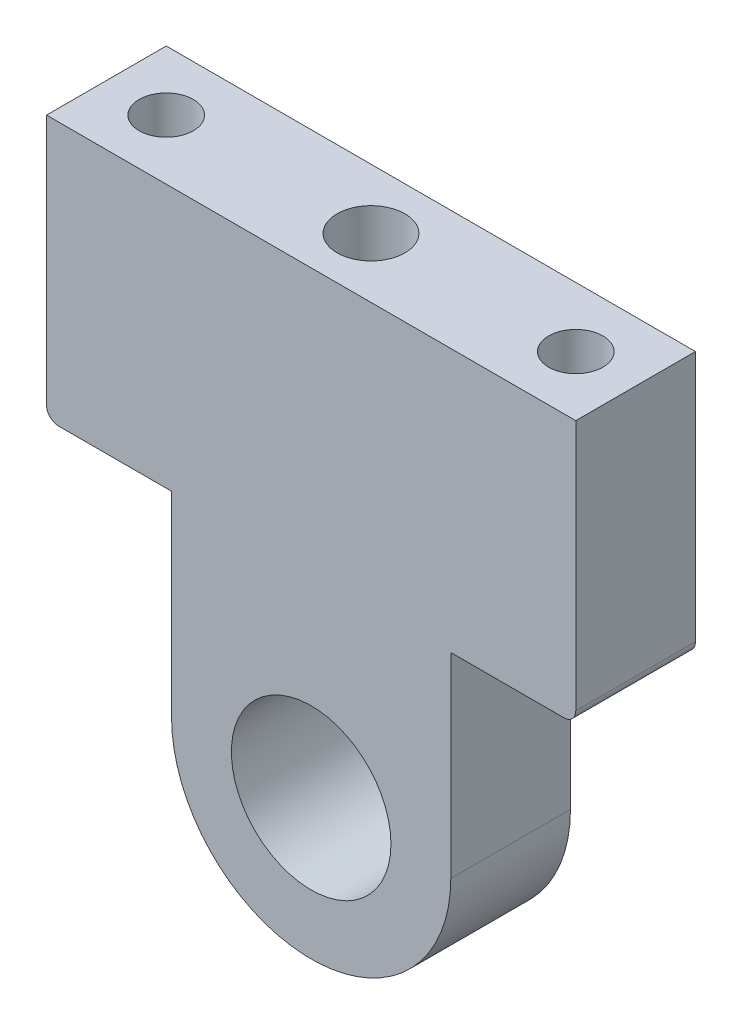
ISO-10303-21;
HEADER;
FILE_DESCRIPTION(('STEP AP214'),'2;1');
FILE_NAME('part.step','',(''),(''),'','','');
FILE_SCHEMA(('AUTOMOTIVE_DESIGN { 1 0 10303 214 1 1 1 1 }'));
ENDSEC;
DATA;
#1=APPLICATION_CONTEXT('core data for automotive mechanical design processes');
#2=APPLICATION_PROTOCOL_DEFINITION('international standard','automotive_design',2000,#1);
#3=PRODUCT_CONTEXT('',#1,'mechanical');
#4=PRODUCT('Part','Part','',(#3));
#5=PRODUCT_RELATED_PRODUCT_CATEGORY('part','',(#4));
#6=PRODUCT_DEFINITION_FORMATION('','',#4);
#7=PRODUCT_DEFINITION_CONTEXT('part definition',#1,'design');
#8=PRODUCT_DEFINITION('design','',#6,#7);
#9=PRODUCT_DEFINITION_SHAPE('','',#8);
#10=(LENGTH_UNIT() NAMED_UNIT(*) SI_UNIT(.MILLI.,.METRE.));
#11=(NAMED_UNIT(*) PLANE_ANGLE_UNIT() SI_UNIT($,.RADIAN.));
#12=(NAMED_UNIT(*) SI_UNIT($,.STERADIAN.) SOLID_ANGLE_UNIT());
#13=UNCERTAINTY_MEASURE_WITH_UNIT(LENGTH_MEASURE(1.E-05),#10,'distance_accuracy_value','');
#14=(GEOMETRIC_REPRESENTATION_CONTEXT(3) GLOBAL_UNCERTAINTY_ASSIGNED_CONTEXT((#13)) GLOBAL_UNIT_ASSIGNED_CONTEXT((#10,
#11,#12)) REPRESENTATION_CONTEXT('',''));
#15=CARTESIAN_POINT('',(0.,0.,0.));
#16=DIRECTION('',(0.,0.,1.));
#17=DIRECTION('',(1.,0.,0.));
#18=AXIS2_PLACEMENT_3D('',#15,#16,#17);
#19=CARTESIAN_POINT('',(33.165,-24.529,15.));
#20=DIRECTION('',(0.,0.,1.));
#21=DIRECTION('',(1.,0.,0.));
#22=AXIS2_PLACEMENT_3D('',#19,#20,#21);
#23=PLANE('',#22);
#24=DIRECTION('',(1.,0.,0.));
#25=VECTOR('',#24,1.);
#26=CARTESIAN_POINT('',(50.665,0.,15.));
#27=LINE('',#26,#25);
#28=CARTESIAN_POINT('',(50.665,0.,15.));
#29=VERTEX_POINT('',#28);
#30=CARTESIAN_POINT('',(64.83,0.,15.));
#31=VERTEX_POINT('',#30);
#32=EDGE_CURVE('E213',#29,#31,#27,.T.);
#33=ORIENTED_EDGE('',*,*,#32,.T.);
#34=CARTESIAN_POINT('',(64.83,1.5,15.));
#35=DIRECTION('',(0.,0.,1.));
#36=DIRECTION('',(1.,0.,0.));
#37=AXIS2_PLACEMENT_3D('',#34,#35,#36);
#38=CIRCLE('',#37,1.5);
#39=CARTESIAN_POINT('',(66.33,1.5,15.));
#40=VERTEX_POINT('',#39);
#41=EDGE_CURVE('E153',#31,#40,#38,.T.);
#42=ORIENTED_EDGE('',*,*,#41,.T.);
#43=DIRECTION('',(0.,1.,0.));
#44=VECTOR('',#43,1.);
#45=CARTESIAN_POINT('',(66.33,0.,15.));
#46=LINE('',#45,#44);
#47=CARTESIAN_POINT('',(66.33,33.,15.));
#48=VERTEX_POINT('',#47);
#49=EDGE_CURVE('E211',#40,#48,#46,.T.);
#50=ORIENTED_EDGE('',*,*,#49,.T.);
#51=DIRECTION('',(-1.,0.,0.));
#52=VECTOR('',#51,1.);
#53=CARTESIAN_POINT('',(0.,33.,15.));
#54=LINE('',#53,#52);
#55=CARTESIAN_POINT('',(0.,33.,15.));
#56=VERTEX_POINT('',#55);
#57=EDGE_CURVE('E217',#48,#56,#54,.T.);
#58=ORIENTED_EDGE('',*,*,#57,.T.);
#59=DIRECTION('',(0.,-1.,0.));
#60=VECTOR('',#59,1.);
#61=CARTESIAN_POINT('',(0.,0.,15.));
#62=LINE('',#61,#60);
#63=CARTESIAN_POINT('',(0.,1.5,15.));
#64=VERTEX_POINT('',#63);
#65=EDGE_CURVE('E170',#56,#64,#62,.T.);
#66=ORIENTED_EDGE('',*,*,#65,.T.);
#67=CARTESIAN_POINT('',(1.5,1.5,15.));
#68=DIRECTION('',(0.,0.,1.));
#69=DIRECTION('',(1.,0.,0.));
#70=AXIS2_PLACEMENT_3D('',#67,#68,#69);
#71=CIRCLE('',#70,1.5);
#72=CARTESIAN_POINT('',(1.5,0.,15.));
#73=VERTEX_POINT('',#72);
#74=EDGE_CURVE('E59',#64,#73,#71,.T.);
#75=ORIENTED_EDGE('',*,*,#74,.T.);
#76=DIRECTION('',(1.,0.,0.));
#77=VECTOR('',#76,1.);
#78=CARTESIAN_POINT('',(0.,0.,15.));
#79=LINE('',#78,#77);
#80=CARTESIAN_POINT('',(15.665,0.,15.));
#81=VERTEX_POINT('',#80);
#82=EDGE_CURVE('E113',#73,#81,#79,.T.);
#83=ORIENTED_EDGE('',*,*,#82,.T.);
#84=DIRECTION('',(0.,-1.,0.));
#85=VECTOR('',#84,1.);
#86=CARTESIAN_POINT('',(15.665,0.,15.));
#87=LINE('',#86,#85);
#88=CARTESIAN_POINT('',(15.665,-24.529,15.));
#89=VERTEX_POINT('',#88);
#90=EDGE_CURVE('E117',#81,#89,#87,.T.);
#91=ORIENTED_EDGE('',*,*,#90,.T.);
#92=CARTESIAN_POINT('',(33.165,-24.529,15.));
#93=DIRECTION('',(0.,0.,1.));
#94=DIRECTION('',(1.,0.,0.));
#95=AXIS2_PLACEMENT_3D('',#92,#93,#94);
#96=CIRCLE('',#95,17.5);
#97=CARTESIAN_POINT('',(50.665,-24.529,15.));
#98=VERTEX_POINT('',#97);
#99=EDGE_CURVE('E132',#89,#98,#96,.T.);
#100=ORIENTED_EDGE('',*,*,#99,.T.);
#101=DIRECTION('',(0.,1.,0.));
#102=VECTOR('',#101,1.);
#103=CARTESIAN_POINT('',(50.665,0.,15.));
#104=LINE('',#103,#102);
#105=EDGE_CURVE('E199',#98,#29,#104,.T.);
#106=ORIENTED_EDGE('',*,*,#105,.T.);
#107=EDGE_LOOP('',(#33,#42,#50,#58,#66,#75,#83,#91,#100,#106));
#108=FACE_BOUND('',#107,.T.);
#109=CARTESIAN_POINT('',(33.165,-24.529,15.));
#110=DIRECTION('',(0.,0.,1.));
#111=DIRECTION('',(1.,0.,0.));
#112=AXIS2_PLACEMENT_3D('',#109,#110,#111);
#113=CIRCLE('',#112,10.);
#114=CARTESIAN_POINT('',(43.165,-24.529,15.));
#115=VERTEX_POINT('',#114);
#116=EDGE_CURVE('E162',#115,#115,#113,.T.);
#117=ORIENTED_EDGE('',*,*,#116,.F.);
#118=EDGE_LOOP('',(#117));
#119=FACE_BOUND('',#118,.T.);
#120=ADVANCED_FACE('F39',(#108,#119),#23,.T.);
#121=CARTESIAN_POINT('',(33.165,-24.529,0.));
#122=DIRECTION('',(0.,0.,1.));
#123=DIRECTION('',(1.,0.,0.));
#124=AXIS2_PLACEMENT_3D('',#121,#122,#123);
#125=PLANE('',#124);
#126=DIRECTION('',(0.,1.,0.));
#127=VECTOR('',#126,1.);
#128=CARTESIAN_POINT('',(66.33,0.,0.));
#129=LINE('',#128,#127);
#130=CARTESIAN_POINT('',(66.33,1.5,0.));
#131=VERTEX_POINT('',#130);
#132=CARTESIAN_POINT('',(66.33,33.,0.));
#133=VERTEX_POINT('',#132);
#134=EDGE_CURVE('E179',#131,#133,#129,.T.);
#135=ORIENTED_EDGE('',*,*,#134,.F.);
#136=CARTESIAN_POINT('',(64.83,1.5,0.));
#137=DIRECTION('',(0.,0.,1.));
#138=DIRECTION('',(1.,0.,0.));
#139=AXIS2_PLACEMENT_3D('',#136,#137,#138);
#140=CIRCLE('',#139,1.5);
#141=CARTESIAN_POINT('',(64.83,0.,0.));
#142=VERTEX_POINT('',#141);
#143=EDGE_CURVE('E148',#131,#142,#140,.F.);
#144=ORIENTED_EDGE('',*,*,#143,.T.);
#145=DIRECTION('',(1.,0.,0.));
#146=VECTOR('',#145,1.);
#147=CARTESIAN_POINT('',(50.665,0.,0.));
#148=LINE('',#147,#146);
#149=CARTESIAN_POINT('',(50.665,0.,0.));
#150=VERTEX_POINT('',#149);
#151=EDGE_CURVE('E176',#150,#142,#148,.T.);
#152=ORIENTED_EDGE('',*,*,#151,.F.);
#153=DIRECTION('',(0.,1.,0.));
#154=VECTOR('',#153,1.);
#155=CARTESIAN_POINT('',(50.665,0.,0.));
#156=LINE('',#155,#154);
#157=CARTESIAN_POINT('',(50.665,-24.529,0.));
#158=VERTEX_POINT('',#157);
#159=EDGE_CURVE('E174',#158,#150,#156,.T.);
#160=ORIENTED_EDGE('',*,*,#159,.F.);
#161=CARTESIAN_POINT('',(33.165,-24.529,0.));
#162=DIRECTION('',(0.,0.,1.));
#163=DIRECTION('',(1.,0.,0.));
#164=AXIS2_PLACEMENT_3D('',#161,#162,#163);
#165=CIRCLE('',#164,17.5);
#166=CARTESIAN_POINT('',(15.665,-24.529,0.));
#167=VERTEX_POINT('',#166);
#168=EDGE_CURVE('E164',#167,#158,#165,.T.);
#169=ORIENTED_EDGE('',*,*,#168,.F.);
#170=DIRECTION('',(0.,-1.,0.));
#171=VECTOR('',#170,1.);
#172=CARTESIAN_POINT('',(15.665,0.,0.));
#173=LINE('',#172,#171);
#174=CARTESIAN_POINT('',(15.665,0.,0.));
#175=VERTEX_POINT('',#174);
#176=EDGE_CURVE('E161',#175,#167,#173,.T.);
#177=ORIENTED_EDGE('',*,*,#176,.F.);
#178=DIRECTION('',(1.,0.,0.));
#179=VECTOR('',#178,1.);
#180=CARTESIAN_POINT('',(0.,0.,0.));
#181=LINE('',#180,#179);
#182=CARTESIAN_POINT('',(1.5,0.,0.));
#183=VERTEX_POINT('',#182);
#184=EDGE_CURVE('E136',#183,#175,#181,.T.);
#185=ORIENTED_EDGE('',*,*,#184,.F.);
#186=CARTESIAN_POINT('',(1.5,1.5,0.));
#187=DIRECTION('',(0.,0.,1.));
#188=DIRECTION('',(1.,0.,0.));
#189=AXIS2_PLACEMENT_3D('',#186,#187,#188);
#190=CIRCLE('',#189,1.5);
#191=CARTESIAN_POINT('',(0.,1.5,0.));
#192=VERTEX_POINT('',#191);
#193=EDGE_CURVE('E141',#183,#192,#190,.F.);
#194=ORIENTED_EDGE('',*,*,#193,.T.);
#195=DIRECTION('',(0.,-1.,0.));
#196=VECTOR('',#195,1.);
#197=CARTESIAN_POINT('',(0.,0.,0.));
#198=LINE('',#197,#196);
#199=CARTESIAN_POINT('',(0.,33.,0.));
#200=VERTEX_POINT('',#199);
#201=EDGE_CURVE('E123',#200,#192,#198,.T.);
#202=ORIENTED_EDGE('',*,*,#201,.F.);
#203=DIRECTION('',(-1.,0.,0.));
#204=VECTOR('',#203,1.);
#205=CARTESIAN_POINT('',(0.,33.,0.));
#206=LINE('',#205,#204);
#207=EDGE_CURVE('E181',#133,#200,#206,.T.);
#208=ORIENTED_EDGE('',*,*,#207,.F.);
#209=EDGE_LOOP('',(#135,#144,#152,#160,#169,#177,#185,#194,#202,#208));
#210=FACE_BOUND('',#209,.T.);
#211=CARTESIAN_POINT('',(33.165,-24.529,0.));
#212=DIRECTION('',(0.,0.,1.));
#213=DIRECTION('',(1.,0.,0.));
#214=AXIS2_PLACEMENT_3D('',#211,#212,#213);
#215=CIRCLE('',#214,10.);
#216=CARTESIAN_POINT('',(43.165,-24.529,0.));
#217=VERTEX_POINT('',#216);
#218=EDGE_CURVE('E167',#217,#217,#215,.T.);
#219=ORIENTED_EDGE('',*,*,#218,.T.);
#220=EDGE_LOOP('',(#219));
#221=FACE_BOUND('',#220,.T.);
#222=ADVANCED_FACE('F157',(#210,#221),#125,.F.);
#223=CARTESIAN_POINT('',(0.,0.,15.));
#224=DIRECTION('',(0.,1.,0.));
#225=DIRECTION('',(-1.,0.,0.));
#226=AXIS2_PLACEMENT_3D('',#223,#224,#225);
#227=PLANE('',#226);
#228=CARTESIAN_POINT('',(7.499,0.,7.5));
#229=DIRECTION('',(0.,1.,0.));
#230=DIRECTION('',(-1.,0.,0.));
#231=AXIS2_PLACEMENT_3D('',#228,#229,#230);
#232=CIRCLE('',#231,3.4);
#233=CARTESIAN_POINT('',(4.099,0.,7.5));
#234=VERTEX_POINT('',#233);
#235=EDGE_CURVE('E228',#234,#234,#232,.T.);
#236=ORIENTED_EDGE('',*,*,#235,.T.);
#237=EDGE_LOOP('',(#236));
#238=FACE_BOUND('',#237,.T.);
#239=ORIENTED_EDGE('',*,*,#82,.F.);
#240=DIRECTION('',(0.,0.,-1.));
#241=VECTOR('',#240,1.);
#242=CARTESIAN_POINT('',(1.5,0.,15.));
#243=LINE('',#242,#241);
#244=EDGE_CURVE('E47',#73,#183,#243,.T.);
#245=ORIENTED_EDGE('',*,*,#244,.T.);
#246=ORIENTED_EDGE('',*,*,#184,.T.);
#247=DIRECTION('',(0.,0.,-1.));
#248=VECTOR('',#247,1.);
#249=CARTESIAN_POINT('',(15.665,0.,15.));
#250=LINE('',#249,#248);
#251=EDGE_CURVE('E128',#81,#175,#250,.T.);
#252=ORIENTED_EDGE('',*,*,#251,.F.);
#253=EDGE_LOOP('',(#239,#245,#246,#252));
#254=FACE_BOUND('',#253,.T.);
#255=ADVANCED_FACE('F134',(#238,#254),#227,.F.);
#256=CARTESIAN_POINT('',(15.665,0.,15.));
#257=DIRECTION('',(1.,0.,0.));
#258=DIRECTION('',(0.,1.,0.));
#259=AXIS2_PLACEMENT_3D('',#256,#257,#258);
#260=PLANE('',#259);
#261=ORIENTED_EDGE('',*,*,#176,.T.);
#262=DIRECTION('',(0.,0.,-1.));
#263=VECTOR('',#262,1.);
#264=CARTESIAN_POINT('',(15.665,-24.529,15.));
#265=LINE('',#264,#263);
#266=EDGE_CURVE('E130',#89,#167,#265,.T.);
#267=ORIENTED_EDGE('',*,*,#266,.F.);
#268=ORIENTED_EDGE('',*,*,#90,.F.);
#269=ORIENTED_EDGE('',*,*,#251,.T.);
#270=EDGE_LOOP('',(#261,#267,#268,#269));
#271=FACE_BOUND('',#270,.T.);
#272=ADVANCED_FACE('F127',(#271),#260,.F.);
#273=CARTESIAN_POINT('',(33.165,-24.529,15.));
#274=DIRECTION('',(0.,0.,-1.));
#275=DIRECTION('',(-1.,0.,0.));
#276=AXIS2_PLACEMENT_3D('',#273,#274,#275);
#277=CYLINDRICAL_SURFACE('',#276,17.5);
#278=ORIENTED_EDGE('',*,*,#168,.T.);
#279=DIRECTION('',(0.,0.,-1.));
#280=VECTOR('',#279,1.);
#281=CARTESIAN_POINT('',(50.665,-24.529,15.));
#282=LINE('',#281,#280);
#283=EDGE_CURVE('E143',#98,#158,#282,.T.);
#284=ORIENTED_EDGE('',*,*,#283,.F.);
#285=ORIENTED_EDGE('',*,*,#99,.F.);
#286=ORIENTED_EDGE('',*,*,#266,.T.);
#287=EDGE_LOOP('',(#278,#284,#285,#286));
#288=FACE_BOUND('',#287,.T.);
#289=ADVANCED_FACE('F288',(#288),#277,.T.);
#290=CARTESIAN_POINT('',(50.665,0.,15.));
#291=DIRECTION('',(-1.,0.,0.));
#292=DIRECTION('',(0.,0.,1.));
#293=AXIS2_PLACEMENT_3D('',#290,#291,#292);
#294=PLANE('',#293);
#295=ORIENTED_EDGE('',*,*,#159,.T.);
#296=DIRECTION('',(0.,0.,-1.));
#297=VECTOR('',#296,1.);
#298=CARTESIAN_POINT('',(50.665,0.,15.));
#299=LINE('',#298,#297);
#300=EDGE_CURVE('E190',#29,#150,#299,.T.);
#301=ORIENTED_EDGE('',*,*,#300,.F.);
#302=ORIENTED_EDGE('',*,*,#105,.F.);
#303=ORIENTED_EDGE('',*,*,#283,.T.);
#304=EDGE_LOOP('',(#295,#301,#302,#303));
#305=FACE_BOUND('',#304,.T.);
#306=ADVANCED_FACE('F197',(#305),#294,.F.);
#307=CARTESIAN_POINT('',(50.665,0.,15.));
#308=DIRECTION('',(0.,1.,0.));
#309=DIRECTION('',(0.,0.,1.));
#310=AXIS2_PLACEMENT_3D('',#307,#308,#309);
#311=PLANE('',#310);
#312=CARTESIAN_POINT('',(58.831,0.,7.5));
#313=DIRECTION('',(0.,1.,0.));
#314=DIRECTION('',(0.,0.,1.));
#315=AXIS2_PLACEMENT_3D('',#312,#313,#314);
#316=CIRCLE('',#315,3.4);
#317=CARTESIAN_POINT('',(58.831,0.,10.9));
#318=VERTEX_POINT('',#317);
#319=EDGE_CURVE('E224',#318,#318,#316,.T.);
#320=ORIENTED_EDGE('',*,*,#319,.T.);
#321=EDGE_LOOP('',(#320));
#322=FACE_BOUND('',#321,.T.);
#323=ORIENTED_EDGE('',*,*,#151,.T.);
#324=DIRECTION('',(0.,0.,-1.));
#325=VECTOR('',#324,1.);
#326=CARTESIAN_POINT('',(64.83,0.,15.));
#327=LINE('',#326,#325);
#328=EDGE_CURVE('E150',#142,#31,#327,.F.);
#329=ORIENTED_EDGE('',*,*,#328,.T.);
#330=ORIENTED_EDGE('',*,*,#32,.F.);
#331=ORIENTED_EDGE('',*,*,#300,.T.);
#332=EDGE_LOOP('',(#323,#329,#330,#331));
#333=FACE_BOUND('',#332,.T.);
#334=ADVANCED_FACE('F204',(#322,#333),#311,.F.);
#335=CARTESIAN_POINT('',(66.33,0.,15.));
#336=DIRECTION('',(-1.,0.,0.));
#337=DIRECTION('',(0.,0.,1.));
#338=AXIS2_PLACEMENT_3D('',#335,#336,#337);
#339=PLANE('',#338);
#340=ORIENTED_EDGE('',*,*,#49,.F.);
#341=DIRECTION('',(0.,0.,-1.));
#342=VECTOR('',#341,1.);
#343=CARTESIAN_POINT('',(66.33,1.5,15.));
#344=LINE('',#343,#342);
#345=EDGE_CURVE('E138',#40,#131,#344,.T.);
#346=ORIENTED_EDGE('',*,*,#345,.T.);
#347=ORIENTED_EDGE('',*,*,#134,.T.);
#348=DIRECTION('',(0.,0.,-1.));
#349=VECTOR('',#348,1.);
#350=CARTESIAN_POINT('',(66.33,33.,15.));
#351=LINE('',#350,#349);
#352=EDGE_CURVE('E187',#48,#133,#351,.T.);
#353=ORIENTED_EDGE('',*,*,#352,.F.);
#354=EDGE_LOOP('',(#340,#346,#347,#353));
#355=FACE_BOUND('',#354,.T.);
#356=ADVANCED_FACE('F215',(#355),#339,.F.);
#357=CARTESIAN_POINT('',(0.,33.,15.));
#358=DIRECTION('',(0.,-1.,0.));
#359=DIRECTION('',(0.,0.,-1.));
#360=AXIS2_PLACEMENT_3D('',#357,#358,#359);
#361=PLANE('',#360);
#362=CARTESIAN_POINT('',(33.165,33.,7.5));
#363=DIRECTION('',(0.,1.,0.));
#364=DIRECTION('',(0.,0.,1.));
#365=AXIS2_PLACEMENT_3D('',#362,#363,#364);
#366=CIRCLE('',#365,4.25000000000001);
#367=CARTESIAN_POINT('',(33.165,33.,11.75));
#368=VERTEX_POINT('',#367);
#369=EDGE_CURVE('E238',#368,#368,#366,.T.);
#370=ORIENTED_EDGE('',*,*,#369,.F.);
#371=EDGE_LOOP('',(#370));
#372=FACE_BOUND('',#371,.T.);
#373=CARTESIAN_POINT('',(58.831,33.,7.5));
#374=DIRECTION('',(0.,1.,0.));
#375=DIRECTION('',(0.,0.,1.));
#376=AXIS2_PLACEMENT_3D('',#373,#374,#375);
#377=CIRCLE('',#376,3.4);
#378=CARTESIAN_POINT('',(58.831,33.,10.9));
#379=VERTEX_POINT('',#378);
#380=EDGE_CURVE('E231',#379,#379,#377,.T.);
#381=ORIENTED_EDGE('',*,*,#380,.F.);
#382=EDGE_LOOP('',(#381));
#383=FACE_BOUND('',#382,.T.);
#384=CARTESIAN_POINT('',(7.499,33.,7.5));
#385=DIRECTION('',(0.,1.,0.));
#386=DIRECTION('',(0.,0.,-1.));
#387=AXIS2_PLACEMENT_3D('',#384,#385,#386);
#388=CIRCLE('',#387,3.4);
#389=CARTESIAN_POINT('',(7.499,33.,4.1));
#390=VERTEX_POINT('',#389);
#391=EDGE_CURVE('E232',#390,#390,#388,.T.);
#392=ORIENTED_EDGE('',*,*,#391,.F.);
#393=EDGE_LOOP('',(#392));
#394=FACE_BOUND('',#393,.T.);
#395=ORIENTED_EDGE('',*,*,#207,.T.);
#396=DIRECTION('',(0.,0.,-1.));
#397=VECTOR('',#396,1.);
#398=CARTESIAN_POINT('',(0.,33.,15.));
#399=LINE('',#398,#397);
#400=EDGE_CURVE('E184',#56,#200,#399,.T.);
#401=ORIENTED_EDGE('',*,*,#400,.F.);
#402=ORIENTED_EDGE('',*,*,#57,.F.);
#403=ORIENTED_EDGE('',*,*,#352,.T.);
#404=EDGE_LOOP('',(#395,#401,#402,#403));
#405=FACE_BOUND('',#404,.T.);
#406=ADVANCED_FACE('F253',(#372,#383,#394,#405),#361,.F.);
#407=CARTESIAN_POINT('',(0.,0.,15.));
#408=DIRECTION('',(1.,0.,0.));
#409=DIRECTION('',(0.,0.,-1.));
#410=AXIS2_PLACEMENT_3D('',#407,#408,#409);
#411=PLANE('',#410);
#412=ORIENTED_EDGE('',*,*,#201,.T.);
#413=DIRECTION('',(0.,0.,-1.));
#414=VECTOR('',#413,1.);
#415=CARTESIAN_POINT('',(0.,1.5,15.));
#416=LINE('',#415,#414);
#417=EDGE_CURVE('E11',#192,#64,#416,.F.);
#418=ORIENTED_EDGE('',*,*,#417,.T.);
#419=ORIENTED_EDGE('',*,*,#65,.F.);
#420=ORIENTED_EDGE('',*,*,#400,.T.);
#421=EDGE_LOOP('',(#412,#418,#419,#420));
#422=FACE_BOUND('',#421,.T.);
#423=ADVANCED_FACE('F256',(#422),#411,.F.);
#424=CARTESIAN_POINT('',(33.165,-24.529,15.));
#425=DIRECTION('',(0.,0.,-1.));
#426=DIRECTION('',(-1.,0.,0.));
#427=AXIS2_PLACEMENT_3D('',#424,#425,#426);
#428=CYLINDRICAL_SURFACE('',#427,10.);
#429=ORIENTED_EDGE('',*,*,#116,.T.);
#430=EDGE_LOOP('',(#429));
#431=FACE_BOUND('',#430,.T.);
#432=ORIENTED_EDGE('',*,*,#218,.F.);
#433=EDGE_LOOP('',(#432));
#434=FACE_BOUND('',#433,.T.);
#435=ADVANCED_FACE('F276',(#431,#434),#428,.F.);
#436=CARTESIAN_POINT('',(7.499,-21.,7.5));
#437=DIRECTION('',(0.,1.,0.));
#438=DIRECTION('',(0.,0.,1.));
#439=AXIS2_PLACEMENT_3D('',#436,#437,#438);
#440=CYLINDRICAL_SURFACE('',#439,3.4);
#441=ORIENTED_EDGE('',*,*,#391,.T.);
#442=EDGE_LOOP('',(#441));
#443=FACE_BOUND('',#442,.T.);
#444=ORIENTED_EDGE('',*,*,#235,.F.);
#445=EDGE_LOOP('',(#444));
#446=FACE_BOUND('',#445,.T.);
#447=ADVANCED_FACE('F299',(#443,#446),#440,.F.);
#448=CARTESIAN_POINT('',(58.831,-21.,7.5));
#449=DIRECTION('',(0.,1.,0.));
#450=DIRECTION('',(0.,0.,1.));
#451=AXIS2_PLACEMENT_3D('',#448,#449,#450);
#452=CYLINDRICAL_SURFACE('',#451,3.4);
#453=ORIENTED_EDGE('',*,*,#380,.T.);
#454=EDGE_LOOP('',(#453));
#455=FACE_BOUND('',#454,.T.);
#456=ORIENTED_EDGE('',*,*,#319,.F.);
#457=EDGE_LOOP('',(#456));
#458=FACE_BOUND('',#457,.T.);
#459=ADVANCED_FACE('F249',(#455,#458),#452,.F.);
#460=CARTESIAN_POINT('',(33.165,5.,7.5));
#461=DIRECTION('',(0.,1.,0.));
#462=DIRECTION('',(0.,0.,1.));
#463=AXIS2_PLACEMENT_3D('',#460,#461,#462);
#464=CYLINDRICAL_SURFACE('',#463,4.25000000000001);
#465=CARTESIAN_POINT('',(33.165,5.,7.5));
#466=DIRECTION('',(0.,1.,0.));
#467=DIRECTION('',(0.,0.,1.));
#468=AXIS2_PLACEMENT_3D('',#465,#466,#467);
#469=CIRCLE('',#468,4.25000000000001);
#470=CARTESIAN_POINT('',(33.165,5.,11.75));
#471=VERTEX_POINT('',#470);
#472=EDGE_CURVE('E235',#471,#471,#469,.T.);
#473=ORIENTED_EDGE('',*,*,#472,.F.);
#474=EDGE_LOOP('',(#473));
#475=FACE_BOUND('',#474,.T.);
#476=ORIENTED_EDGE('',*,*,#369,.T.);
#477=EDGE_LOOP('',(#476));
#478=FACE_BOUND('',#477,.T.);
#479=ADVANCED_FACE('F246',(#475,#478),#464,.F.);
#480=CARTESIAN_POINT('',(33.165,5.,7.5));
#481=DIRECTION('',(0.,1.,0.));
#482=DIRECTION('',(0.,0.,1.));
#483=AXIS2_PLACEMENT_3D('',#480,#481,#482);
#484=PLANE('',#483);
#485=ORIENTED_EDGE('',*,*,#472,.T.);
#486=EDGE_LOOP('',(#485));
#487=FACE_BOUND('',#486,.T.);
#488=ADVANCED_FACE('F244',(#487),#484,.T.);
#489=CARTESIAN_POINT('',(64.83,1.5,15.));
#490=DIRECTION('',(0.,0.,-1.));
#491=DIRECTION('',(-1.,0.,0.));
#492=AXIS2_PLACEMENT_3D('',#489,#490,#491);
#493=CYLINDRICAL_SURFACE('',#492,1.5);
#494=ORIENTED_EDGE('',*,*,#41,.F.);
#495=ORIENTED_EDGE('',*,*,#328,.F.);
#496=ORIENTED_EDGE('',*,*,#143,.F.);
#497=ORIENTED_EDGE('',*,*,#345,.F.);
#498=EDGE_LOOP('',(#494,#495,#496,#497));
#499=FACE_BOUND('',#498,.T.);
#500=ADVANCED_FACE('F208',(#499),#493,.T.);
#501=CARTESIAN_POINT('',(1.5,1.5,15.));
#502=DIRECTION('',(0.,0.,-1.));
#503=DIRECTION('',(-1.,0.,0.));
#504=AXIS2_PLACEMENT_3D('',#501,#502,#503);
#505=CYLINDRICAL_SURFACE('',#504,1.5);
#506=ORIENTED_EDGE('',*,*,#74,.F.);
#507=ORIENTED_EDGE('',*,*,#417,.F.);
#508=ORIENTED_EDGE('',*,*,#193,.F.);
#509=ORIENTED_EDGE('',*,*,#244,.F.);
#510=EDGE_LOOP('',(#506,#507,#508,#509));
#511=FACE_BOUND('',#510,.T.);
#512=ADVANCED_FACE('F41',(#511),#505,.T.);
#513=CLOSED_SHELL('',(#120,#222,#255,#272,#289,#306,#334,#356,#406,#423,#435,#447,#459,#479,
#488,#500,#512));
#514=MANIFOLD_SOLID_BREP('B2',#513);
#515=ADVANCED_BREP_SHAPE_REPRESENTATION('',(#18,#514),#14);
#516=SHAPE_DEFINITION_REPRESENTATION(#9,#515);
ENDSEC;
END-ISO-10303-21;
